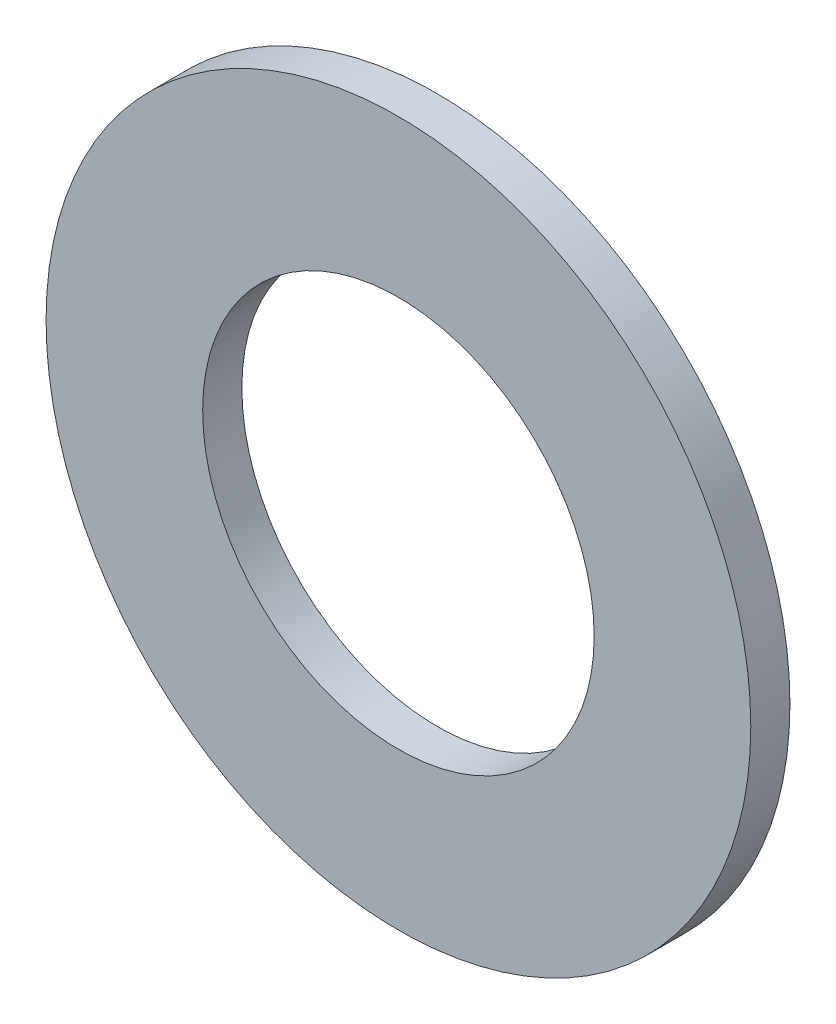
ISO-10303-21;
HEADER;
FILE_DESCRIPTION(('STEP AP214'),'2;1');
FILE_NAME('part.step','',(''),(''),'','','');
FILE_SCHEMA(('AUTOMOTIVE_DESIGN { 1 0 10303 214 1 1 1 1 }'));
ENDSEC;
DATA;
#1=APPLICATION_CONTEXT('core data for automotive mechanical design processes');
#2=APPLICATION_PROTOCOL_DEFINITION('international standard','automotive_design',2000,#1);
#3=PRODUCT_CONTEXT('',#1,'mechanical');
#4=PRODUCT('Part','Part','',(#3));
#5=PRODUCT_RELATED_PRODUCT_CATEGORY('part','',(#4));
#6=PRODUCT_DEFINITION_FORMATION('','',#4);
#7=PRODUCT_DEFINITION_CONTEXT('part definition',#1,'design');
#8=PRODUCT_DEFINITION('design','',#6,#7);
#9=PRODUCT_DEFINITION_SHAPE('','',#8);
#10=(LENGTH_UNIT() NAMED_UNIT(*) SI_UNIT(.MILLI.,.METRE.));
#11=(NAMED_UNIT(*) PLANE_ANGLE_UNIT() SI_UNIT($,.RADIAN.));
#12=(NAMED_UNIT(*) SI_UNIT($,.STERADIAN.) SOLID_ANGLE_UNIT());
#13=UNCERTAINTY_MEASURE_WITH_UNIT(LENGTH_MEASURE(1.E-05),#10,'distance_accuracy_value','');
#14=(GEOMETRIC_REPRESENTATION_CONTEXT(3) GLOBAL_UNCERTAINTY_ASSIGNED_CONTEXT((#13)) GLOBAL_UNIT_ASSIGNED_CONTEXT((#10,
#11,#12)) REPRESENTATION_CONTEXT('',''));
#15=CARTESIAN_POINT('',(0.,0.,0.));
#16=DIRECTION('',(0.,0.,1.));
#17=DIRECTION('',(1.,0.,0.));
#18=AXIS2_PLACEMENT_3D('',#15,#16,#17);
#19=CARTESIAN_POINT('',(0.,0.,76.2));
#20=DIRECTION('',(0.,0.,1.));
#21=DIRECTION('',(1.,0.,0.));
#22=AXIS2_PLACEMENT_3D('',#19,#20,#21);
#23=PLANE('',#22);
#24=CARTESIAN_POINT('',(0.,0.,76.2));
#25=DIRECTION('',(0.,0.,1.));
#26=DIRECTION('',(1.,0.,0.));
#27=AXIS2_PLACEMENT_3D('',#24,#25,#26);
#28=CIRCLE('',#27,28.575);
#29=CARTESIAN_POINT('',(-28.575,0.,76.2));
#30=VERTEX_POINT('',#29);
#31=EDGE_CURVE('E11',#30,#30,#28,.T.);
#32=ORIENTED_EDGE('',*,*,#31,.T.);
#33=EDGE_LOOP('',(#32));
#34=FACE_BOUND('',#33,.T.);
#35=CARTESIAN_POINT('',(0.,0.,76.2));
#36=DIRECTION('',(0.,0.,1.));
#37=DIRECTION('',(1.,0.,0.));
#38=AXIS2_PLACEMENT_3D('',#35,#36,#37);
#39=CIRCLE('',#38,15.875);
#40=CARTESIAN_POINT('',(-15.875,0.,76.2));
#41=VERTEX_POINT('',#40);
#42=EDGE_CURVE('E55',#41,#41,#39,.T.);
#43=ORIENTED_EDGE('',*,*,#42,.F.);
#44=EDGE_LOOP('',(#43));
#45=FACE_BOUND('',#44,.T.);
#46=ADVANCED_FACE('F46',(#34,#45),#23,.T.);
#47=CARTESIAN_POINT('',(0.,0.,76.2));
#48=DIRECTION('',(0.,0.,-1.));
#49=DIRECTION('',(-1.,0.,0.));
#50=AXIS2_PLACEMENT_3D('',#47,#48,#49);
#51=CYLINDRICAL_SURFACE('',#50,28.575);
#52=CARTESIAN_POINT('',(0.,0.,73.025));
#53=DIRECTION('',(0.,0.,1.));
#54=DIRECTION('',(1.,0.,0.));
#55=AXIS2_PLACEMENT_3D('',#52,#53,#54);
#56=CIRCLE('',#55,28.575);
#57=CARTESIAN_POINT('',(-28.575,0.,73.025));
#58=VERTEX_POINT('',#57);
#59=EDGE_CURVE('E61',#58,#58,#56,.T.);
#60=CARTESIAN_POINT('',(-28.575,0.,73.025));
#61=CARTESIAN_POINT('',(-28.575,0.,73.0580729166667));
#62=CARTESIAN_POINT('',(-28.575,0.,73.0911458333333));
#63=CARTESIAN_POINT('',(-28.575,0.,73.1572916666667));
#64=CARTESIAN_POINT('',(-28.575,0.,73.1903645833333));
#65=CARTESIAN_POINT('',(-28.575,0.,73.2565104166667));
#66=CARTESIAN_POINT('',(-28.575,0.,73.2895833333333));
#67=CARTESIAN_POINT('',(-28.575,0.,73.3557291666667));
#68=CARTESIAN_POINT('',(-28.575,0.,73.3888020833333));
#69=CARTESIAN_POINT('',(-28.575,0.,73.4549479166667));
#70=CARTESIAN_POINT('',(-28.575,0.,73.4880208333333));
#71=CARTESIAN_POINT('',(-28.575,0.,73.5541666666667));
#72=CARTESIAN_POINT('',(-28.575,0.,73.5872395833333));
#73=CARTESIAN_POINT('',(-28.575,0.,73.6533854166667));
#74=CARTESIAN_POINT('',(-28.575,0.,73.6864583333333));
#75=CARTESIAN_POINT('',(-28.575,0.,73.7526041666667));
#76=CARTESIAN_POINT('',(-28.575,0.,73.7856770833333));
#77=CARTESIAN_POINT('',(-28.575,0.,73.8518229166667));
#78=CARTESIAN_POINT('',(-28.575,0.,73.8848958333333));
#79=CARTESIAN_POINT('',(-28.575,0.,73.9510416666667));
#80=CARTESIAN_POINT('',(-28.575,0.,73.9841145833333));
#81=CARTESIAN_POINT('',(-28.575,0.,74.0502604166667));
#82=CARTESIAN_POINT('',(-28.575,0.,74.0833333333333));
#83=CARTESIAN_POINT('',(-28.575,0.,74.1494791666667));
#84=CARTESIAN_POINT('',(-28.575,0.,74.1825520833333));
#85=CARTESIAN_POINT('',(-28.575,0.,74.2486979166667));
#86=CARTESIAN_POINT('',(-28.575,0.,74.2817708333333));
#87=CARTESIAN_POINT('',(-28.575,0.,74.3479166666667));
#88=CARTESIAN_POINT('',(-28.575,0.,74.3809895833333));
#89=CARTESIAN_POINT('',(-28.575,0.,74.4471354166667));
#90=CARTESIAN_POINT('',(-28.575,0.,74.4802083333333));
#91=CARTESIAN_POINT('',(-28.575,0.,74.5463541666667));
#92=CARTESIAN_POINT('',(-28.575,0.,74.5794270833333));
#93=CARTESIAN_POINT('',(-28.575,0.,74.6455729166667));
#94=CARTESIAN_POINT('',(-28.575,0.,74.6786458333333));
#95=CARTESIAN_POINT('',(-28.575,0.,74.7447916666667));
#96=CARTESIAN_POINT('',(-28.575,0.,74.7778645833333));
#97=CARTESIAN_POINT('',(-28.575,0.,74.8440104166667));
#98=CARTESIAN_POINT('',(-28.575,0.,74.8770833333333));
#99=CARTESIAN_POINT('',(-28.575,0.,74.9432291666667));
#100=CARTESIAN_POINT('',(-28.575,0.,74.9763020833333));
#101=CARTESIAN_POINT('',(-28.575,0.,75.0424479166667));
#102=CARTESIAN_POINT('',(-28.575,0.,75.0755208333333));
#103=CARTESIAN_POINT('',(-28.575,0.,75.1416666666667));
#104=CARTESIAN_POINT('',(-28.575,0.,75.1747395833333));
#105=CARTESIAN_POINT('',(-28.575,0.,75.2408854166667));
#106=CARTESIAN_POINT('',(-28.575,0.,75.2739583333333));
#107=CARTESIAN_POINT('',(-28.575,0.,75.3401041666667));
#108=CARTESIAN_POINT('',(-28.575,0.,75.3731770833333));
#109=CARTESIAN_POINT('',(-28.575,0.,75.4393229166667));
#110=CARTESIAN_POINT('',(-28.575,0.,75.4723958333333));
#111=CARTESIAN_POINT('',(-28.575,0.,75.5385416666667));
#112=CARTESIAN_POINT('',(-28.575,0.,75.5716145833333));
#113=CARTESIAN_POINT('',(-28.575,0.,75.6377604166667));
#114=CARTESIAN_POINT('',(-28.575,0.,75.6708333333333));
#115=CARTESIAN_POINT('',(-28.575,0.,75.7369791666667));
#116=CARTESIAN_POINT('',(-28.575,0.,75.7700520833333));
#117=CARTESIAN_POINT('',(-28.575,0.,75.8361979166667));
#118=CARTESIAN_POINT('',(-28.575,0.,75.8692708333333));
#119=CARTESIAN_POINT('',(-28.575,0.,75.9354166666667));
#120=CARTESIAN_POINT('',(-28.575,0.,75.9684895833333));
#121=CARTESIAN_POINT('',(-28.575,0.,76.0346354166667));
#122=CARTESIAN_POINT('',(-28.575,0.,76.0677083333333));
#123=CARTESIAN_POINT('',(-28.575,0.,76.1338541666667));
#124=CARTESIAN_POINT('',(-28.575,0.,76.1669270833333));
#125=CARTESIAN_POINT('',(-28.575,0.,76.2));
#126=B_SPLINE_CURVE_WITH_KNOTS('',3,(#60,#61,#62,#63,#64,#65,#66,#67,#68,#69,#70,#71,#72,#73,
#74,#75,#76,#77,#78,#79,#80,#81,#82,#83,#84,#85,#86,#87,#88,#89,#90,#91,#92,#93,#94,#95,#96,#97,
#98,#99,#100,#101,#102,#103,#104,#105,#106,#107,#108,#109,#110,#111,#112,#113,#114,#115,#116,
#117,#118,#119,#120,#121,#122,#123,#124,#125),.UNSPECIFIED.,.F.,.F.,(4,2,2,2,2,2,2,2,2,2,2,2,2,
2,2,2,2,2,2,2,2,2,2,2,2,2,2,2,2,2,2,2,4),(0.,0.0992187500000047,0.198437500000009,0.29765625,
0.396875000000005,0.49609375000001,0.5953125,0.694531250000005,0.79375000000001,
0.892968750000001,0.992187500000005,1.09140625000001,1.190625,1.28984375000001,1.38906250000001,
1.48828125,1.58750000000001,1.68671875000001,1.7859375,1.88515625000001,1.98437500000001,
2.08359375,2.18281250000001,2.28203125000001,2.38125,2.48046875000001,2.57968750000001,
2.67890625,2.77812500000001,2.87734375000001,2.9765625,3.07578125000001,3.17500000000001),.UNSPECIFIED.);
#127=EDGE_CURVE('BSEAM48',#58,#30,#126,.T.);
#128=ORIENTED_EDGE('',*,*,#59,.T.);
#129=ORIENTED_EDGE('',*,*,#31,.F.);
#130=ORIENTED_EDGE('',*,*,#127,.T.);
#131=ORIENTED_EDGE('',*,*,#127,.F.);
#132=EDGE_LOOP('',(#128,#130,#129,#131));
#133=FACE_BOUND('',#132,.T.);
#134=ADVANCED_FACE('F48',(#133),#51,.T.);
#135=CARTESIAN_POINT('',(0.,0.,76.2));
#136=DIRECTION('',(0.,0.,-1.));
#137=DIRECTION('',(-1.,0.,0.));
#138=AXIS2_PLACEMENT_3D('',#135,#136,#137);
#139=CYLINDRICAL_SURFACE('',#138,15.875);
#140=CARTESIAN_POINT('',(0.,0.,73.025));
#141=DIRECTION('',(0.,0.,1.));
#142=DIRECTION('',(1.,0.,0.));
#143=AXIS2_PLACEMENT_3D('',#140,#141,#142);
#144=CIRCLE('',#143,15.875);
#145=CARTESIAN_POINT('',(-15.875,0.,73.025));
#146=VERTEX_POINT('',#145);
#147=EDGE_CURVE('E50',#146,#146,#144,.T.);
#148=CARTESIAN_POINT('',(-15.875,0.,73.025));
#149=CARTESIAN_POINT('',(-15.875,0.,73.0580729166667));
#150=CARTESIAN_POINT('',(-15.875,0.,73.0911458333333));
#151=CARTESIAN_POINT('',(-15.875,0.,73.1572916666667));
#152=CARTESIAN_POINT('',(-15.875,0.,73.1903645833333));
#153=CARTESIAN_POINT('',(-15.875,0.,73.2565104166667));
#154=CARTESIAN_POINT('',(-15.875,0.,73.2895833333333));
#155=CARTESIAN_POINT('',(-15.875,0.,73.3557291666667));
#156=CARTESIAN_POINT('',(-15.875,0.,73.3888020833333));
#157=CARTESIAN_POINT('',(-15.875,0.,73.4549479166667));
#158=CARTESIAN_POINT('',(-15.875,0.,73.4880208333333));
#159=CARTESIAN_POINT('',(-15.875,0.,73.5541666666667));
#160=CARTESIAN_POINT('',(-15.875,0.,73.5872395833333));
#161=CARTESIAN_POINT('',(-15.875,0.,73.6533854166667));
#162=CARTESIAN_POINT('',(-15.875,0.,73.6864583333333));
#163=CARTESIAN_POINT('',(-15.875,0.,73.7526041666667));
#164=CARTESIAN_POINT('',(-15.875,0.,73.7856770833333));
#165=CARTESIAN_POINT('',(-15.875,0.,73.8518229166667));
#166=CARTESIAN_POINT('',(-15.875,0.,73.8848958333333));
#167=CARTESIAN_POINT('',(-15.875,0.,73.9510416666667));
#168=CARTESIAN_POINT('',(-15.875,0.,73.9841145833333));
#169=CARTESIAN_POINT('',(-15.875,0.,74.0502604166667));
#170=CARTESIAN_POINT('',(-15.875,0.,74.0833333333333));
#171=CARTESIAN_POINT('',(-15.875,0.,74.1494791666667));
#172=CARTESIAN_POINT('',(-15.875,0.,74.1825520833333));
#173=CARTESIAN_POINT('',(-15.875,0.,74.2486979166667));
#174=CARTESIAN_POINT('',(-15.875,0.,74.2817708333333));
#175=CARTESIAN_POINT('',(-15.875,0.,74.3479166666667));
#176=CARTESIAN_POINT('',(-15.875,0.,74.3809895833333));
#177=CARTESIAN_POINT('',(-15.875,0.,74.4471354166667));
#178=CARTESIAN_POINT('',(-15.875,0.,74.4802083333333));
#179=CARTESIAN_POINT('',(-15.875,0.,74.5463541666667));
#180=CARTESIAN_POINT('',(-15.875,0.,74.5794270833333));
#181=CARTESIAN_POINT('',(-15.875,0.,74.6455729166667));
#182=CARTESIAN_POINT('',(-15.875,0.,74.6786458333333));
#183=CARTESIAN_POINT('',(-15.875,0.,74.7447916666667));
#184=CARTESIAN_POINT('',(-15.875,0.,74.7778645833333));
#185=CARTESIAN_POINT('',(-15.875,0.,74.8440104166667));
#186=CARTESIAN_POINT('',(-15.875,0.,74.8770833333333));
#187=CARTESIAN_POINT('',(-15.875,0.,74.9432291666667));
#188=CARTESIAN_POINT('',(-15.875,0.,74.9763020833333));
#189=CARTESIAN_POINT('',(-15.875,0.,75.0424479166667));
#190=CARTESIAN_POINT('',(-15.875,0.,75.0755208333333));
#191=CARTESIAN_POINT('',(-15.875,0.,75.1416666666667));
#192=CARTESIAN_POINT('',(-15.875,0.,75.1747395833333));
#193=CARTESIAN_POINT('',(-15.875,0.,75.2408854166667));
#194=CARTESIAN_POINT('',(-15.875,0.,75.2739583333333));
#195=CARTESIAN_POINT('',(-15.875,0.,75.3401041666667));
#196=CARTESIAN_POINT('',(-15.875,0.,75.3731770833333));
#197=CARTESIAN_POINT('',(-15.875,0.,75.4393229166667));
#198=CARTESIAN_POINT('',(-15.875,0.,75.4723958333333));
#199=CARTESIAN_POINT('',(-15.875,0.,75.5385416666667));
#200=CARTESIAN_POINT('',(-15.875,0.,75.5716145833333));
#201=CARTESIAN_POINT('',(-15.875,0.,75.6377604166667));
#202=CARTESIAN_POINT('',(-15.875,0.,75.6708333333333));
#203=CARTESIAN_POINT('',(-15.875,0.,75.7369791666667));
#204=CARTESIAN_POINT('',(-15.875,0.,75.7700520833333));
#205=CARTESIAN_POINT('',(-15.875,0.,75.8361979166667));
#206=CARTESIAN_POINT('',(-15.875,0.,75.8692708333333));
#207=CARTESIAN_POINT('',(-15.875,0.,75.9354166666667));
#208=CARTESIAN_POINT('',(-15.875,0.,75.9684895833333));
#209=CARTESIAN_POINT('',(-15.875,0.,76.0346354166667));
#210=CARTESIAN_POINT('',(-15.875,0.,76.0677083333333));
#211=CARTESIAN_POINT('',(-15.875,0.,76.1338541666667));
#212=CARTESIAN_POINT('',(-15.875,0.,76.1669270833333));
#213=CARTESIAN_POINT('',(-15.875,0.,76.2));
#214=B_SPLINE_CURVE_WITH_KNOTS('',3,(#148,#149,#150,#151,#152,#153,#154,#155,#156,#157,#158,
#159,#160,#161,#162,#163,#164,#165,#166,#167,#168,#169,#170,#171,#172,#173,#174,#175,#176,#177,
#178,#179,#180,#181,#182,#183,#184,#185,#186,#187,#188,#189,#190,#191,#192,#193,#194,#195,#196,
#197,#198,#199,#200,#201,#202,#203,#204,#205,#206,#207,#208,#209,#210,#211,#212,#213),
.UNSPECIFIED.,.F.,.F.,(4,2,2,2,2,2,2,2,2,2,2,2,2,2,2,2,2,2,2,2,2,2,2,2,2,2,2,2,2,2,2,2,4),(0.,
0.0992187500000047,0.198437500000009,0.29765625,0.396875000000005,0.49609375000001,0.5953125,
0.694531250000005,0.79375000000001,0.892968750000001,0.992187500000005,1.09140625000001,
1.190625,1.28984375000001,1.38906250000001,1.48828125,1.58750000000001,1.68671875000001,
1.7859375,1.88515625000001,1.98437500000001,2.08359375,2.18281250000001,2.28203125000001,
2.38125,2.48046875000001,2.57968750000001,2.67890625,2.77812500000001,2.87734375000001,
2.9765625,3.07578125000001,3.17500000000001),.UNSPECIFIED.);
#215=EDGE_CURVE('BSEAM75',#146,#41,#214,.T.);
#216=ORIENTED_EDGE('',*,*,#147,.F.);
#217=ORIENTED_EDGE('',*,*,#42,.T.);
#218=ORIENTED_EDGE('',*,*,#215,.T.);
#219=ORIENTED_EDGE('',*,*,#215,.F.);
#220=EDGE_LOOP('',(#216,#218,#217,#219));
#221=FACE_BOUND('',#220,.T.);
#222=ADVANCED_FACE('F75',(#221),#139,.F.);
#223=CARTESIAN_POINT('',(0.,0.,73.025));
#224=DIRECTION('',(0.,0.,1.));
#225=DIRECTION('',(1.,0.,0.));
#226=AXIS2_PLACEMENT_3D('',#223,#224,#225);
#227=PLANE('',#226);
#228=ORIENTED_EDGE('',*,*,#147,.T.);
#229=EDGE_LOOP('',(#228));
#230=FACE_BOUND('',#229,.T.);
#231=ORIENTED_EDGE('',*,*,#59,.F.);
#232=EDGE_LOOP('',(#231));
#233=FACE_BOUND('',#232,.T.);
#234=ADVANCED_FACE('F72',(#230,#233),#227,.F.);
#235=CLOSED_SHELL('',(#46,#134,#222,#234));
#236=MANIFOLD_SOLID_BREP('B2',#235);
#237=ADVANCED_BREP_SHAPE_REPRESENTATION('',(#18,#236),#14);
#238=SHAPE_DEFINITION_REPRESENTATION(#9,#237);
ENDSEC;
END-ISO-10303-21;
